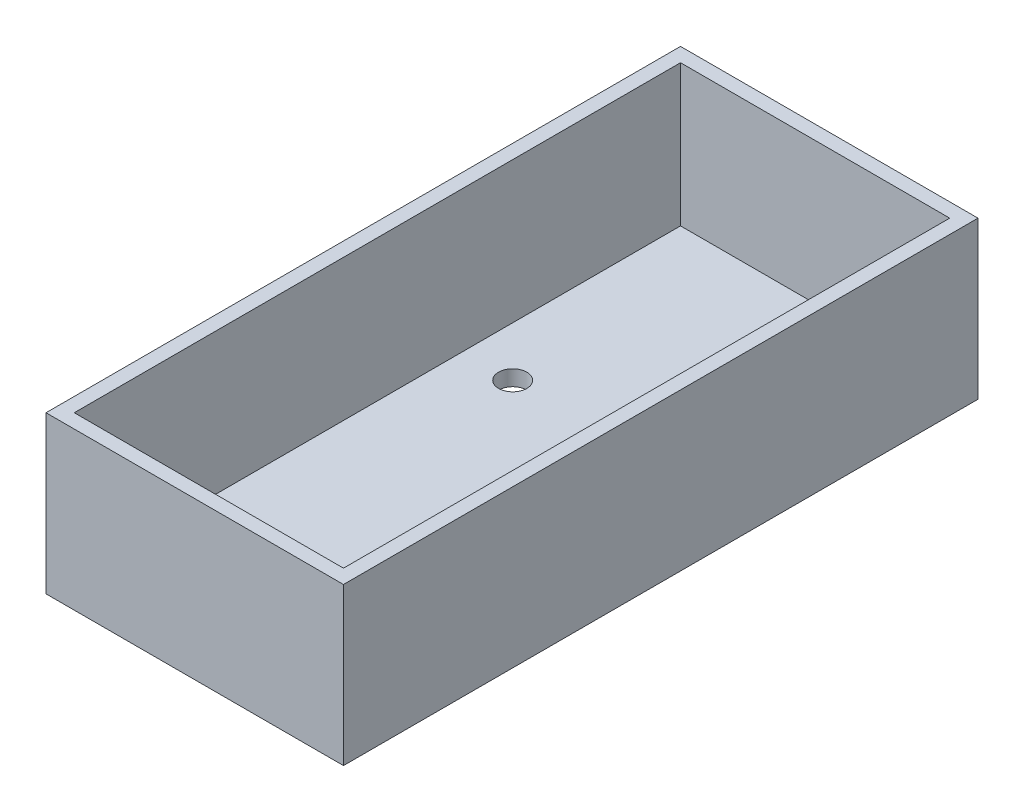
ISO-10303-21;
HEADER;
FILE_DESCRIPTION(('STEP AP214'),'2;1');
FILE_NAME('part.step','',(''),(''),'','','');
FILE_SCHEMA(('AUTOMOTIVE_DESIGN { 1 0 10303 214 1 1 1 1 }'));
ENDSEC;
DATA;
#1=APPLICATION_CONTEXT('core data for automotive mechanical design processes');
#2=APPLICATION_PROTOCOL_DEFINITION('international standard','automotive_design',2000,#1);
#3=PRODUCT_CONTEXT('',#1,'mechanical');
#4=PRODUCT('Part','Part','',(#3));
#5=PRODUCT_RELATED_PRODUCT_CATEGORY('part','',(#4));
#6=PRODUCT_DEFINITION_FORMATION('','',#4);
#7=PRODUCT_DEFINITION_CONTEXT('part definition',#1,'design');
#8=PRODUCT_DEFINITION('design','',#6,#7);
#9=PRODUCT_DEFINITION_SHAPE('','',#8);
#10=(LENGTH_UNIT() NAMED_UNIT(*) SI_UNIT(.MILLI.,.METRE.));
#11=(NAMED_UNIT(*) PLANE_ANGLE_UNIT() SI_UNIT($,.RADIAN.));
#12=(NAMED_UNIT(*) SI_UNIT($,.STERADIAN.) SOLID_ANGLE_UNIT());
#13=UNCERTAINTY_MEASURE_WITH_UNIT(LENGTH_MEASURE(1.E-05),#10,'distance_accuracy_value','');
#14=(GEOMETRIC_REPRESENTATION_CONTEXT(3) GLOBAL_UNCERTAINTY_ASSIGNED_CONTEXT((#13)) GLOBAL_UNIT_ASSIGNED_CONTEXT((#10,
#11,#12)) REPRESENTATION_CONTEXT('',''));
#15=CARTESIAN_POINT('',(0.,0.,0.));
#16=DIRECTION('',(0.,0.,1.));
#17=DIRECTION('',(1.,0.,0.));
#18=AXIS2_PLACEMENT_3D('',#15,#16,#17);
#19=CARTESIAN_POINT('',(21.05,22.2,44.9));
#20=DIRECTION('',(-1.,0.,0.));
#21=DIRECTION('',(0.,0.,1.));
#22=AXIS2_PLACEMENT_3D('',#19,#20,#21);
#23=PLANE('',#22);
#24=DIRECTION('',(0.,0.,-1.));
#25=VECTOR('',#24,1.);
#26=CARTESIAN_POINT('',(21.05,0.,44.9));
#27=LINE('',#26,#25);
#28=CARTESIAN_POINT('',(21.05,0.,44.9));
#29=VERTEX_POINT('',#28);
#30=CARTESIAN_POINT('',(21.05,0.,-44.9));
#31=VERTEX_POINT('',#30);
#32=EDGE_CURVE('E145',#29,#31,#27,.T.);
#33=ORIENTED_EDGE('',*,*,#32,.T.);
#34=DIRECTION('',(0.,-1.,0.));
#35=VECTOR('',#34,1.);
#36=CARTESIAN_POINT('',(21.05,22.2,-44.9));
#37=LINE('',#36,#35);
#38=CARTESIAN_POINT('',(21.05,22.2,-44.9));
#39=VERTEX_POINT('',#38);
#40=EDGE_CURVE('E11',#39,#31,#37,.T.);
#41=ORIENTED_EDGE('',*,*,#40,.F.);
#42=DIRECTION('',(0.,0.,-1.));
#43=VECTOR('',#42,1.);
#44=CARTESIAN_POINT('',(21.05,22.2,44.9));
#45=LINE('',#44,#43);
#46=CARTESIAN_POINT('',(21.05,22.2,44.9));
#47=VERTEX_POINT('',#46);
#48=EDGE_CURVE('E149',#47,#39,#45,.T.);
#49=ORIENTED_EDGE('',*,*,#48,.F.);
#50=DIRECTION('',(0.,-1.,0.));
#51=VECTOR('',#50,1.);
#52=CARTESIAN_POINT('',(21.05,22.2,44.9));
#53=LINE('',#52,#51);
#54=EDGE_CURVE('E155',#47,#29,#53,.T.);
#55=ORIENTED_EDGE('',*,*,#54,.T.);
#56=EDGE_LOOP('',(#33,#41,#49,#55));
#57=FACE_BOUND('',#56,.T.);
#58=ADVANCED_FACE('F33',(#57),#23,.F.);
#59=CARTESIAN_POINT('',(21.05,22.2,-44.9));
#60=DIRECTION('',(0.,0.,1.));
#61=DIRECTION('',(1.,0.,0.));
#62=AXIS2_PLACEMENT_3D('',#59,#60,#61);
#63=PLANE('',#62);
#64=DIRECTION('',(-1.,0.,0.));
#65=VECTOR('',#64,1.);
#66=CARTESIAN_POINT('',(21.05,0.,-44.9));
#67=LINE('',#66,#65);
#68=CARTESIAN_POINT('',(-21.05,0.,-44.9));
#69=VERTEX_POINT('',#68);
#70=EDGE_CURVE('E158',#31,#69,#67,.T.);
#71=ORIENTED_EDGE('',*,*,#70,.T.);
#72=DIRECTION('',(0.,-1.,0.));
#73=VECTOR('',#72,1.);
#74=CARTESIAN_POINT('',(-21.05,22.2,-44.9));
#75=LINE('',#74,#73);
#76=CARTESIAN_POINT('',(-21.05,22.2,-44.9));
#77=VERTEX_POINT('',#76);
#78=EDGE_CURVE('E40',#77,#69,#75,.T.);
#79=ORIENTED_EDGE('',*,*,#78,.F.);
#80=DIRECTION('',(-1.,0.,0.));
#81=VECTOR('',#80,1.);
#82=CARTESIAN_POINT('',(21.05,22.2,-44.9));
#83=LINE('',#82,#81);
#84=EDGE_CURVE('E84',#39,#77,#83,.T.);
#85=ORIENTED_EDGE('',*,*,#84,.F.);
#86=ORIENTED_EDGE('',*,*,#40,.T.);
#87=EDGE_LOOP('',(#71,#79,#85,#86));
#88=FACE_BOUND('',#87,.T.);
#89=ADVANCED_FACE('F187',(#88),#63,.F.);
#90=CARTESIAN_POINT('',(-21.05,22.2,44.9));
#91=DIRECTION('',(1.,0.,0.));
#92=DIRECTION('',(0.,0.,-1.));
#93=AXIS2_PLACEMENT_3D('',#90,#91,#92);
#94=PLANE('',#93);
#95=DIRECTION('',(0.,0.,1.));
#96=VECTOR('',#95,1.);
#97=CARTESIAN_POINT('',(-21.05,0.,44.9));
#98=LINE('',#97,#96);
#99=CARTESIAN_POINT('',(-21.05,0.,44.9));
#100=VERTEX_POINT('',#99);
#101=EDGE_CURVE('E160',#69,#100,#98,.T.);
#102=ORIENTED_EDGE('',*,*,#101,.T.);
#103=DIRECTION('',(0.,-1.,0.));
#104=VECTOR('',#103,1.);
#105=CARTESIAN_POINT('',(-21.05,22.2,44.9));
#106=LINE('',#105,#104);
#107=CARTESIAN_POINT('',(-21.05,22.2,44.9));
#108=VERTEX_POINT('',#107);
#109=EDGE_CURVE('E164',#108,#100,#106,.T.);
#110=ORIENTED_EDGE('',*,*,#109,.F.);
#111=DIRECTION('',(0.,0.,1.));
#112=VECTOR('',#111,1.);
#113=CARTESIAN_POINT('',(-21.05,22.2,44.9));
#114=LINE('',#113,#112);
#115=EDGE_CURVE('E152',#77,#108,#114,.T.);
#116=ORIENTED_EDGE('',*,*,#115,.F.);
#117=ORIENTED_EDGE('',*,*,#78,.T.);
#118=EDGE_LOOP('',(#102,#110,#116,#117));
#119=FACE_BOUND('',#118,.T.);
#120=ADVANCED_FACE('F169',(#119),#94,.F.);
#121=CARTESIAN_POINT('',(21.05,22.2,44.9));
#122=DIRECTION('',(0.,0.,-1.));
#123=DIRECTION('',(-1.,0.,0.));
#124=AXIS2_PLACEMENT_3D('',#121,#122,#123);
#125=PLANE('',#124);
#126=DIRECTION('',(1.,0.,0.));
#127=VECTOR('',#126,1.);
#128=CARTESIAN_POINT('',(21.05,0.,44.9));
#129=LINE('',#128,#127);
#130=EDGE_CURVE('E77',#100,#29,#129,.T.);
#131=ORIENTED_EDGE('',*,*,#130,.T.);
#132=ORIENTED_EDGE('',*,*,#54,.F.);
#133=DIRECTION('',(1.,0.,0.));
#134=VECTOR('',#133,1.);
#135=CARTESIAN_POINT('',(21.05,22.2,44.9));
#136=LINE('',#135,#134);
#137=EDGE_CURVE('E56',#108,#47,#136,.T.);
#138=ORIENTED_EDGE('',*,*,#137,.F.);
#139=ORIENTED_EDGE('',*,*,#109,.T.);
#140=EDGE_LOOP('',(#131,#132,#138,#139));
#141=FACE_BOUND('',#140,.T.);
#142=ADVANCED_FACE('F177',(#141),#125,.F.);
#143=CARTESIAN_POINT('',(0.,22.2,0.));
#144=DIRECTION('',(0.,1.,0.));
#145=DIRECTION('',(0.,0.,1.));
#146=AXIS2_PLACEMENT_3D('',#143,#144,#145);
#147=PLANE('',#146);
#148=DIRECTION('',(0.,0.,-1.));
#149=VECTOR('',#148,1.);
#150=CARTESIAN_POINT('',(19.05,22.2,-42.9));
#151=LINE('',#150,#149);
#152=CARTESIAN_POINT('',(19.05,22.2,42.9));
#153=VERTEX_POINT('',#152);
#154=CARTESIAN_POINT('',(19.05,22.2,-42.9));
#155=VERTEX_POINT('',#154);
#156=EDGE_CURVE('E47',#153,#155,#151,.T.);
#157=ORIENTED_EDGE('',*,*,#156,.F.);
#158=DIRECTION('',(1.,0.,0.));
#159=VECTOR('',#158,1.);
#160=CARTESIAN_POINT('',(-19.05,22.2,42.9));
#161=LINE('',#160,#159);
#162=CARTESIAN_POINT('',(-19.05,22.2,42.9));
#163=VERTEX_POINT('',#162);
#164=EDGE_CURVE('E126',#163,#153,#161,.T.);
#165=ORIENTED_EDGE('',*,*,#164,.F.);
#166=DIRECTION('',(0.,0.,1.));
#167=VECTOR('',#166,1.);
#168=CARTESIAN_POINT('',(-19.05,22.2,-42.9));
#169=LINE('',#168,#167);
#170=CARTESIAN_POINT('',(-19.05,22.2,-42.9));
#171=VERTEX_POINT('',#170);
#172=EDGE_CURVE('E129',#171,#163,#169,.T.);
#173=ORIENTED_EDGE('',*,*,#172,.F.);
#174=DIRECTION('',(-1.,0.,0.));
#175=VECTOR('',#174,1.);
#176=CARTESIAN_POINT('',(-19.05,22.2,-42.9));
#177=LINE('',#176,#175);
#178=EDGE_CURVE('E138',#155,#171,#177,.T.);
#179=ORIENTED_EDGE('',*,*,#178,.F.);
#180=EDGE_LOOP('',(#157,#165,#173,#179));
#181=FACE_BOUND('',#180,.T.);
#182=ORIENTED_EDGE('',*,*,#48,.T.);
#183=ORIENTED_EDGE('',*,*,#84,.T.);
#184=ORIENTED_EDGE('',*,*,#115,.T.);
#185=ORIENTED_EDGE('',*,*,#137,.T.);
#186=EDGE_LOOP('',(#182,#183,#184,#185));
#187=FACE_BOUND('',#186,.T.);
#188=ADVANCED_FACE('F179',(#181,#187),#147,.T.);
#189=CARTESIAN_POINT('',(0.,0.,0.));
#190=DIRECTION('',(0.,1.,0.));
#191=DIRECTION('',(0.,0.,1.));
#192=AXIS2_PLACEMENT_3D('',#189,#190,#191);
#193=PLANE('',#192);
#194=CARTESIAN_POINT('',(-12.,0.,27.9));
#195=DIRECTION('',(0.,1.,0.));
#196=DIRECTION('',(0.,0.,1.));
#197=AXIS2_PLACEMENT_3D('',#194,#195,#196);
#198=CIRCLE('',#197,2.);
#199=CARTESIAN_POINT('',(-12.,0.,29.9));
#200=VERTEX_POINT('',#199);
#201=EDGE_CURVE('E306',#200,#200,#198,.T.);
#202=ORIENTED_EDGE('',*,*,#201,.T.);
#203=EDGE_LOOP('',(#202));
#204=FACE_BOUND('',#203,.T.);
#205=CARTESIAN_POINT('',(12.,0.,27.9));
#206=DIRECTION('',(0.,1.,0.));
#207=DIRECTION('',(0.,0.,1.));
#208=AXIS2_PLACEMENT_3D('',#205,#206,#207);
#209=CIRCLE('',#208,2.);
#210=CARTESIAN_POINT('',(12.,0.,29.9));
#211=VERTEX_POINT('',#210);
#212=EDGE_CURVE('E327',#211,#211,#209,.T.);
#213=ORIENTED_EDGE('',*,*,#212,.T.);
#214=EDGE_LOOP('',(#213));
#215=FACE_BOUND('',#214,.T.);
#216=CARTESIAN_POINT('',(12.,0.,-12.1));
#217=DIRECTION('',(0.,1.,0.));
#218=DIRECTION('',(0.,0.,1.));
#219=AXIS2_PLACEMENT_3D('',#216,#217,#218);
#220=CIRCLE('',#219,2.);
#221=CARTESIAN_POINT('',(12.,0.,-10.1));
#222=VERTEX_POINT('',#221);
#223=EDGE_CURVE('E318',#222,#222,#220,.T.);
#224=ORIENTED_EDGE('',*,*,#223,.T.);
#225=EDGE_LOOP('',(#224));
#226=FACE_BOUND('',#225,.T.);
#227=CARTESIAN_POINT('',(-12.,0.,-12.1));
#228=DIRECTION('',(0.,1.,0.));
#229=DIRECTION('',(0.,0.,1.));
#230=AXIS2_PLACEMENT_3D('',#227,#228,#229);
#231=CIRCLE('',#230,2.);
#232=CARTESIAN_POINT('',(-12.,0.,-10.1));
#233=VERTEX_POINT('',#232);
#234=EDGE_CURVE('E139',#233,#233,#231,.T.);
#235=ORIENTED_EDGE('',*,*,#234,.T.);
#236=EDGE_LOOP('',(#235));
#237=FACE_BOUND('',#236,.T.);
#238=ORIENTED_EDGE('',*,*,#32,.F.);
#239=ORIENTED_EDGE('',*,*,#130,.F.);
#240=ORIENTED_EDGE('',*,*,#101,.F.);
#241=ORIENTED_EDGE('',*,*,#70,.F.);
#242=EDGE_LOOP('',(#238,#239,#240,#241));
#243=FACE_BOUND('',#242,.T.);
#244=ADVANCED_FACE('F173',(#204,#215,#226,#237,#243),#193,.F.);
#245=CARTESIAN_POINT('',(19.05,2.2,-42.9));
#246=DIRECTION('',(1.,0.,0.));
#247=DIRECTION('',(0.,0.,-1.));
#248=AXIS2_PLACEMENT_3D('',#245,#246,#247);
#249=PLANE('',#248);
#250=ORIENTED_EDGE('',*,*,#156,.T.);
#251=DIRECTION('',(0.,1.,0.));
#252=VECTOR('',#251,1.);
#253=CARTESIAN_POINT('',(19.05,2.2,-42.9));
#254=LINE('',#253,#252);
#255=CARTESIAN_POINT('',(19.05,2.2,-42.9));
#256=VERTEX_POINT('',#255);
#257=EDGE_CURVE('E104',#256,#155,#254,.T.);
#258=ORIENTED_EDGE('',*,*,#257,.F.);
#259=DIRECTION('',(0.,0.,-1.));
#260=VECTOR('',#259,1.);
#261=CARTESIAN_POINT('',(19.05,2.2,-42.9));
#262=LINE('',#261,#260);
#263=CARTESIAN_POINT('',(19.05,2.2,42.9));
#264=VERTEX_POINT('',#263);
#265=EDGE_CURVE('E108',#264,#256,#262,.T.);
#266=ORIENTED_EDGE('',*,*,#265,.F.);
#267=DIRECTION('',(0.,1.,0.));
#268=VECTOR('',#267,1.);
#269=CARTESIAN_POINT('',(19.05,2.2,42.9));
#270=LINE('',#269,#268);
#271=EDGE_CURVE('E143',#264,#153,#270,.T.);
#272=ORIENTED_EDGE('',*,*,#271,.T.);
#273=EDGE_LOOP('',(#250,#258,#266,#272));
#274=FACE_BOUND('',#273,.T.);
#275=ADVANCED_FACE('F106',(#274),#249,.F.);
#276=CARTESIAN_POINT('',(-19.05,2.2,42.9));
#277=DIRECTION('',(0.,0.,1.));
#278=DIRECTION('',(1.,0.,0.));
#279=AXIS2_PLACEMENT_3D('',#276,#277,#278);
#280=PLANE('',#279);
#281=ORIENTED_EDGE('',*,*,#164,.T.);
#282=ORIENTED_EDGE('',*,*,#271,.F.);
#283=DIRECTION('',(1.,0.,0.));
#284=VECTOR('',#283,1.);
#285=CARTESIAN_POINT('',(-19.05,2.2,42.9));
#286=LINE('',#285,#284);
#287=CARTESIAN_POINT('',(-19.05,2.2,42.9));
#288=VERTEX_POINT('',#287);
#289=EDGE_CURVE('E114',#288,#264,#286,.T.);
#290=ORIENTED_EDGE('',*,*,#289,.F.);
#291=DIRECTION('',(0.,1.,0.));
#292=VECTOR('',#291,1.);
#293=CARTESIAN_POINT('',(-19.05,2.2,42.9));
#294=LINE('',#293,#292);
#295=EDGE_CURVE('E146',#288,#163,#294,.T.);
#296=ORIENTED_EDGE('',*,*,#295,.T.);
#297=EDGE_LOOP('',(#281,#282,#290,#296));
#298=FACE_BOUND('',#297,.T.);
#299=ADVANCED_FACE('F221',(#298),#280,.F.);
#300=CARTESIAN_POINT('',(-19.05,2.2,-42.9));
#301=DIRECTION('',(-1.,0.,0.));
#302=DIRECTION('',(0.,0.,1.));
#303=AXIS2_PLACEMENT_3D('',#300,#301,#302);
#304=PLANE('',#303);
#305=ORIENTED_EDGE('',*,*,#172,.T.);
#306=ORIENTED_EDGE('',*,*,#295,.F.);
#307=DIRECTION('',(0.,0.,1.));
#308=VECTOR('',#307,1.);
#309=CARTESIAN_POINT('',(-19.05,2.2,-42.9));
#310=LINE('',#309,#308);
#311=CARTESIAN_POINT('',(-19.05,2.2,-42.9));
#312=VERTEX_POINT('',#311);
#313=EDGE_CURVE('E122',#312,#288,#310,.T.);
#314=ORIENTED_EDGE('',*,*,#313,.F.);
#315=DIRECTION('',(0.,1.,0.));
#316=VECTOR('',#315,1.);
#317=CARTESIAN_POINT('',(-19.05,2.2,-42.9));
#318=LINE('',#317,#316);
#319=EDGE_CURVE('E113',#312,#171,#318,.T.);
#320=ORIENTED_EDGE('',*,*,#319,.T.);
#321=EDGE_LOOP('',(#305,#306,#314,#320));
#322=FACE_BOUND('',#321,.T.);
#323=ADVANCED_FACE('F230',(#322),#304,.F.);
#324=CARTESIAN_POINT('',(-19.05,2.2,-42.9));
#325=DIRECTION('',(0.,0.,-1.));
#326=DIRECTION('',(-1.,0.,0.));
#327=AXIS2_PLACEMENT_3D('',#324,#325,#326);
#328=PLANE('',#327);
#329=ORIENTED_EDGE('',*,*,#178,.T.);
#330=ORIENTED_EDGE('',*,*,#319,.F.);
#331=DIRECTION('',(-1.,0.,0.));
#332=VECTOR('',#331,1.);
#333=CARTESIAN_POINT('',(-19.05,2.2,-42.9));
#334=LINE('',#333,#332);
#335=EDGE_CURVE('E117',#256,#312,#334,.T.);
#336=ORIENTED_EDGE('',*,*,#335,.F.);
#337=ORIENTED_EDGE('',*,*,#257,.T.);
#338=EDGE_LOOP('',(#329,#330,#336,#337));
#339=FACE_BOUND('',#338,.T.);
#340=ADVANCED_FACE('F118',(#339),#328,.F.);
#341=CARTESIAN_POINT('',(0.,2.2,0.));
#342=DIRECTION('',(0.,1.,0.));
#343=DIRECTION('',(0.,0.,1.));
#344=AXIS2_PLACEMENT_3D('',#341,#342,#343);
#345=PLANE('',#344);
#346=CARTESIAN_POINT('',(-12.,2.2,27.9));
#347=DIRECTION('',(0.,1.,0.));
#348=DIRECTION('',(0.,0.,1.));
#349=AXIS2_PLACEMENT_3D('',#346,#347,#348);
#350=CIRCLE('',#349,2.);
#351=CARTESIAN_POINT('',(-12.,2.2,29.9));
#352=VERTEX_POINT('',#351);
#353=EDGE_CURVE('E309',#352,#352,#350,.T.);
#354=ORIENTED_EDGE('',*,*,#353,.F.);
#355=EDGE_LOOP('',(#354));
#356=FACE_BOUND('',#355,.T.);
#357=CARTESIAN_POINT('',(12.,2.2,27.9));
#358=DIRECTION('',(0.,1.,0.));
#359=DIRECTION('',(0.,0.,1.));
#360=AXIS2_PLACEMENT_3D('',#357,#358,#359);
#361=CIRCLE('',#360,2.);
#362=CARTESIAN_POINT('',(12.,2.2,29.9));
#363=VERTEX_POINT('',#362);
#364=EDGE_CURVE('E311',#363,#363,#361,.T.);
#365=ORIENTED_EDGE('',*,*,#364,.F.);
#366=EDGE_LOOP('',(#365));
#367=FACE_BOUND('',#366,.T.);
#368=CARTESIAN_POINT('',(12.,2.2,-12.1));
#369=DIRECTION('',(0.,1.,0.));
#370=DIRECTION('',(0.,0.,1.));
#371=AXIS2_PLACEMENT_3D('',#368,#369,#370);
#372=CIRCLE('',#371,2.);
#373=CARTESIAN_POINT('',(12.,2.2,-10.1));
#374=VERTEX_POINT('',#373);
#375=EDGE_CURVE('E322',#374,#374,#372,.T.);
#376=ORIENTED_EDGE('',*,*,#375,.F.);
#377=EDGE_LOOP('',(#376));
#378=FACE_BOUND('',#377,.T.);
#379=CARTESIAN_POINT('',(-12.,2.2,-12.1));
#380=DIRECTION('',(0.,1.,0.));
#381=DIRECTION('',(0.,0.,1.));
#382=AXIS2_PLACEMENT_3D('',#379,#380,#381);
#383=CIRCLE('',#382,2.);
#384=CARTESIAN_POINT('',(-12.,2.2,-10.1));
#385=VERTEX_POINT('',#384);
#386=EDGE_CURVE('E132',#385,#385,#383,.T.);
#387=ORIENTED_EDGE('',*,*,#386,.F.);
#388=EDGE_LOOP('',(#387));
#389=FACE_BOUND('',#388,.T.);
#390=ORIENTED_EDGE('',*,*,#265,.T.);
#391=ORIENTED_EDGE('',*,*,#335,.T.);
#392=ORIENTED_EDGE('',*,*,#313,.T.);
#393=ORIENTED_EDGE('',*,*,#289,.T.);
#394=EDGE_LOOP('',(#390,#391,#392,#393));
#395=FACE_BOUND('',#394,.T.);
#396=ADVANCED_FACE('F124',(#356,#367,#378,#389,#395),#345,.T.);
#397=CARTESIAN_POINT('',(-12.,0.,-12.1));
#398=DIRECTION('',(0.,1.,0.));
#399=DIRECTION('',(0.,0.,1.));
#400=AXIS2_PLACEMENT_3D('',#397,#398,#399);
#401=CYLINDRICAL_SURFACE('',#400,2.);
#402=ORIENTED_EDGE('',*,*,#234,.F.);
#403=EDGE_LOOP('',(#402));
#404=FACE_BOUND('',#403,.T.);
#405=ORIENTED_EDGE('',*,*,#386,.T.);
#406=EDGE_LOOP('',(#405));
#407=FACE_BOUND('',#406,.T.);
#408=ADVANCED_FACE('F261',(#404,#407),#401,.F.);
#409=CARTESIAN_POINT('',(12.,0.,-12.1));
#410=DIRECTION('',(0.,1.,0.));
#411=DIRECTION('',(0.,0.,1.));
#412=AXIS2_PLACEMENT_3D('',#409,#410,#411);
#413=CYLINDRICAL_SURFACE('',#412,2.);
#414=ORIENTED_EDGE('',*,*,#223,.F.);
#415=EDGE_LOOP('',(#414));
#416=FACE_BOUND('',#415,.T.);
#417=ORIENTED_EDGE('',*,*,#375,.T.);
#418=EDGE_LOOP('',(#417));
#419=FACE_BOUND('',#418,.T.);
#420=ADVANCED_FACE('F269',(#416,#419),#413,.F.);
#421=CARTESIAN_POINT('',(12.,0.,27.9));
#422=DIRECTION('',(0.,1.,0.));
#423=DIRECTION('',(0.,0.,1.));
#424=AXIS2_PLACEMENT_3D('',#421,#422,#423);
#425=CYLINDRICAL_SURFACE('',#424,2.);
#426=ORIENTED_EDGE('',*,*,#212,.F.);
#427=EDGE_LOOP('',(#426));
#428=FACE_BOUND('',#427,.T.);
#429=ORIENTED_EDGE('',*,*,#364,.T.);
#430=EDGE_LOOP('',(#429));
#431=FACE_BOUND('',#430,.T.);
#432=ADVANCED_FACE('F279',(#428,#431),#425,.F.);
#433=CARTESIAN_POINT('',(-12.,0.,27.9));
#434=DIRECTION('',(0.,1.,0.));
#435=DIRECTION('',(0.,0.,1.));
#436=AXIS2_PLACEMENT_3D('',#433,#434,#435);
#437=CYLINDRICAL_SURFACE('',#436,2.);
#438=ORIENTED_EDGE('',*,*,#201,.F.);
#439=EDGE_LOOP('',(#438));
#440=FACE_BOUND('',#439,.T.);
#441=ORIENTED_EDGE('',*,*,#353,.T.);
#442=EDGE_LOOP('',(#441));
#443=FACE_BOUND('',#442,.T.);
#444=ADVANCED_FACE('F289',(#440,#443),#437,.F.);
#445=CLOSED_SHELL('',(#58,#89,#120,#142,#188,#244,#275,#299,#323,#340,#396,#408,#420,#432,#444));
#446=MANIFOLD_SOLID_BREP('B2',#445);
#447=ADVANCED_BREP_SHAPE_REPRESENTATION('',(#18,#446),#14);
#448=SHAPE_DEFINITION_REPRESENTATION(#9,#447);
ENDSEC;
END-ISO-10303-21;
